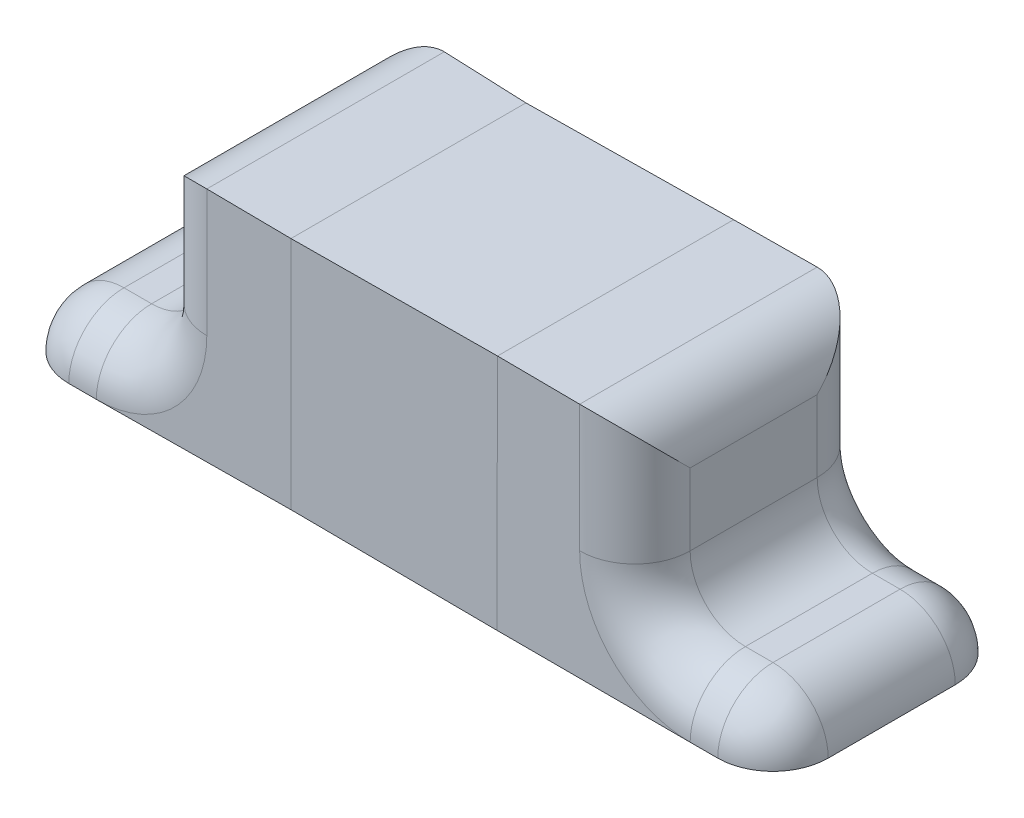
ISO-10303-21;
HEADER;
FILE_DESCRIPTION(('STEP AP214'),'2;1');
FILE_NAME('part.step','',(''),(''),'','','');
FILE_SCHEMA(('AUTOMOTIVE_DESIGN { 1 0 10303 214 1 1 1 1 }'));
ENDSEC;
DATA;
#1=APPLICATION_CONTEXT('core data for automotive mechanical design processes');
#2=APPLICATION_PROTOCOL_DEFINITION('international standard','automotive_design',2000,#1);
#3=PRODUCT_CONTEXT('',#1,'mechanical');
#4=PRODUCT('Part','Part','',(#3));
#5=PRODUCT_RELATED_PRODUCT_CATEGORY('part','',(#4));
#6=PRODUCT_DEFINITION_FORMATION('','',#4);
#7=PRODUCT_DEFINITION_CONTEXT('part definition',#1,'design');
#8=PRODUCT_DEFINITION('design','',#6,#7);
#9=PRODUCT_DEFINITION_SHAPE('','',#8);
#10=(LENGTH_UNIT() NAMED_UNIT(*) SI_UNIT(.MILLI.,.METRE.));
#11=(NAMED_UNIT(*) PLANE_ANGLE_UNIT() SI_UNIT($,.RADIAN.));
#12=(NAMED_UNIT(*) SI_UNIT($,.STERADIAN.) SOLID_ANGLE_UNIT());
#13=UNCERTAINTY_MEASURE_WITH_UNIT(LENGTH_MEASURE(1.E-05),#10,'distance_accuracy_value','');
#14=(GEOMETRIC_REPRESENTATION_CONTEXT(3) GLOBAL_UNCERTAINTY_ASSIGNED_CONTEXT((#13)) GLOBAL_UNIT_ASSIGNED_CONTEXT((#10,
#11,#12)) REPRESENTATION_CONTEXT('',''));
#15=CARTESIAN_POINT('',(0.,0.,0.));
#16=DIRECTION('',(0.,0.,1.));
#17=DIRECTION('',(1.,0.,0.));
#18=AXIS2_PLACEMENT_3D('',#15,#16,#17);
#19=CARTESIAN_POINT('',(-1.175,-0.00155700990971797,0.23));
#20=DIRECTION('',(0.,0.,1.));
#21=DIRECTION('',(1.,0.,0.));
#22=AXIS2_PLACEMENT_3D('',#19,#20,#21);
#23=SPHERICAL_SURFACE('',#22,0.2);
#24=CARTESIAN_POINT('',(-1.175,-0.00155700990971796,0.23));
#25=DIRECTION('',(0.,-1.,0.));
#26=DIRECTION('',(0.,0.,-1.));
#27=AXIS2_PLACEMENT_3D('',#24,#25,#26);
#28=CIRCLE('',#27,0.2);
#29=CARTESIAN_POINT('',(-1.175,-0.00155700990971797,0.43));
#30=VERTEX_POINT('',#29);
#31=CARTESIAN_POINT('',(-1.375,-0.00155700990971797,0.23));
#32=VERTEX_POINT('',#31);
#33=EDGE_CURVE('E393',#30,#32,#28,.T.);
#34=ORIENTED_EDGE('',*,*,#33,.F.);
#35=CARTESIAN_POINT('',(-1.175,-0.00155700990971797,0.23));
#36=DIRECTION('',(1.,0.,0.));
#37=DIRECTION('',(0.,0.,-1.));
#38=AXIS2_PLACEMENT_3D('',#35,#36,#37);
#39=CIRCLE('',#38,0.2);
#40=CARTESIAN_POINT('',(-1.175,0.198442990090282,0.23));
#41=VERTEX_POINT('',#40);
#42=EDGE_CURVE('E292',#41,#30,#39,.T.);
#43=ORIENTED_EDGE('',*,*,#42,.F.);
#44=CARTESIAN_POINT('',(-1.175,-0.00155700990971797,0.23));
#45=DIRECTION('',(0.,0.,-1.));
#46=DIRECTION('',(-1.,0.,0.));
#47=AXIS2_PLACEMENT_3D('',#44,#45,#46);
#48=CIRCLE('',#47,0.2);
#49=EDGE_CURVE('E332',#32,#41,#48,.T.);
#50=ORIENTED_EDGE('',*,*,#49,.F.);
#51=EDGE_LOOP('',(#34,#43,#50));
#52=FACE_BOUND('',#51,.T.);
#53=ADVANCED_FACE('F17',(#52),#23,.T.);
#54=CARTESIAN_POINT('',(-1.175,-0.00155700990971797,-0.23));
#55=DIRECTION('',(0.,0.,1.));
#56=DIRECTION('',(1.,0.,0.));
#57=AXIS2_PLACEMENT_3D('',#54,#55,#56);
#58=SPHERICAL_SURFACE('',#57,0.2);
#59=CARTESIAN_POINT('',(-1.175,-0.00155700990971793,-0.23));
#60=DIRECTION('',(0.,-1.,0.));
#61=DIRECTION('',(0.,0.,-1.));
#62=AXIS2_PLACEMENT_3D('',#59,#60,#61);
#63=CIRCLE('',#62,0.2);
#64=CARTESIAN_POINT('',(-1.375,-0.00155700990971797,-0.23));
#65=VERTEX_POINT('',#64);
#66=CARTESIAN_POINT('',(-1.175,-0.00155700990971792,-0.43));
#67=VERTEX_POINT('',#66);
#68=EDGE_CURVE('E284',#65,#67,#63,.T.);
#69=ORIENTED_EDGE('',*,*,#68,.F.);
#70=CARTESIAN_POINT('',(-1.175,-0.00155700990971797,-0.23));
#71=DIRECTION('',(0.,0.,1.));
#72=DIRECTION('',(-1.,0.,0.));
#73=AXIS2_PLACEMENT_3D('',#70,#71,#72);
#74=CIRCLE('',#73,0.2);
#75=CARTESIAN_POINT('',(-1.175,0.198442990090282,-0.23));
#76=VERTEX_POINT('',#75);
#77=EDGE_CURVE('E368',#76,#65,#74,.T.);
#78=ORIENTED_EDGE('',*,*,#77,.F.);
#79=CARTESIAN_POINT('',(-1.175,-0.00155700990971797,-0.23));
#80=DIRECTION('',(1.,0.,0.));
#81=DIRECTION('',(0.,0.,-1.));
#82=AXIS2_PLACEMENT_3D('',#79,#80,#81);
#83=CIRCLE('',#82,0.2);
#84=EDGE_CURVE('E45',#67,#76,#83,.T.);
#85=ORIENTED_EDGE('',*,*,#84,.F.);
#86=EDGE_LOOP('',(#69,#78,#85));
#87=FACE_BOUND('',#86,.T.);
#88=ADVANCED_FACE('F937',(#87),#58,.T.);
#89=CARTESIAN_POINT('',(-0.675,-0.00155700990971792,-0.23));
#90=DIRECTION('',(0.,-1.,0.));
#91=DIRECTION('',(0.,0.,-1.));
#92=AXIS2_PLACEMENT_3D('',#89,#90,#91);
#93=CYLINDRICAL_SURFACE('',#92,0.2);
#94=CARTESIAN_POINT('',(-0.675,0.398442990090282,-0.23));
#95=DIRECTION('',(0.,1.,0.));
#96=DIRECTION('',(0.,0.,-1.));
#97=AXIS2_PLACEMENT_3D('',#94,#95,#96);
#98=CIRCLE('',#97,0.2);
#99=CARTESIAN_POINT('',(-0.675,0.398442990090282,-0.43));
#100=VERTEX_POINT('',#99);
#101=CARTESIAN_POINT('',(-0.875,0.398442990090282,-0.23));
#102=VERTEX_POINT('',#101);
#103=EDGE_CURVE('E31',#100,#102,#98,.T.);
#104=ORIENTED_EDGE('',*,*,#103,.T.);
#105=DIRECTION('',(0.,-1.,0.));
#106=VECTOR('',#105,1.);
#107=CARTESIAN_POINT('',(-0.875,0.398442990090282,-0.23));
#108=LINE('',#107,#106);
#109=CARTESIAN_POINT('',(-0.875,0.658442990090282,-0.23));
#110=VERTEX_POINT('',#109);
#111=EDGE_CURVE('E337',#110,#102,#108,.T.);
#112=ORIENTED_EDGE('',*,*,#111,.F.);
#113=CARTESIAN_POINT('',(-0.675,0.658442990090282,-0.23));
#114=DIRECTION('',(0.,-0.707106781186548,-0.707106781186548));
#115=DIRECTION('',(0.,0.707106781186548,-0.707106781186548));
#116=AXIS2_PLACEMENT_3D('',#113,#114,#115);
#117=ELLIPSE('',#116,0.282842712474619,0.2);
#118=CARTESIAN_POINT('',(-0.675,0.858442990090282,-0.43));
#119=VERTEX_POINT('',#118);
#120=EDGE_CURVE('E11',#110,#119,#117,.T.);
#121=ORIENTED_EDGE('',*,*,#120,.T.);
#122=DIRECTION('',(0.,1.,0.));
#123=VECTOR('',#122,1.);
#124=CARTESIAN_POINT('',(-0.675,0.398442990090282,-0.43));
#125=LINE('',#124,#123);
#126=EDGE_CURVE('E274',#100,#119,#125,.T.);
#127=ORIENTED_EDGE('',*,*,#126,.F.);
#128=EDGE_LOOP('',(#104,#112,#121,#127));
#129=FACE_BOUND('',#128,.T.);
#130=ADVANCED_FACE('F943',(#129),#93,.T.);
#131=CARTESIAN_POINT('',(-0.675,0.658442990090282,0.43));
#132=DIRECTION('',(0.,0.,-1.));
#133=DIRECTION('',(-1.,0.,0.));
#134=AXIS2_PLACEMENT_3D('',#131,#132,#133);
#135=CYLINDRICAL_SURFACE('',#134,0.2);
#136=CARTESIAN_POINT('',(-0.675,0.658442990090282,0.23));
#137=DIRECTION('',(0.,0.707106781186548,-0.707106781186548));
#138=DIRECTION('',(0.,-0.707106781186548,-0.707106781186548));
#139=AXIS2_PLACEMENT_3D('',#136,#137,#138);
#140=ELLIPSE('',#139,0.282842712474619,0.2);
#141=CARTESIAN_POINT('',(-0.875,0.658442990090282,0.23));
#142=VERTEX_POINT('',#141);
#143=CARTESIAN_POINT('',(-0.675,0.858442990090282,0.43));
#144=VERTEX_POINT('',#143);
#145=EDGE_CURVE('E386',#142,#144,#140,.T.);
#146=ORIENTED_EDGE('',*,*,#145,.T.);
#147=DIRECTION('',(0.,0.,1.));
#148=VECTOR('',#147,1.);
#149=CARTESIAN_POINT('',(-0.675,0.858442990090282,-0.43));
#150=LINE('',#149,#148);
#151=EDGE_CURVE('E410',#119,#144,#150,.T.);
#152=ORIENTED_EDGE('',*,*,#151,.F.);
#153=ORIENTED_EDGE('',*,*,#120,.F.);
#154=DIRECTION('',(0.,0.,-1.));
#155=VECTOR('',#154,1.);
#156=CARTESIAN_POINT('',(-0.875,0.658442990090282,-0.23));
#157=LINE('',#156,#155);
#158=EDGE_CURVE('E333',#142,#110,#157,.T.);
#159=ORIENTED_EDGE('',*,*,#158,.F.);
#160=EDGE_LOOP('',(#146,#152,#153,#159));
#161=FACE_BOUND('',#160,.T.);
#162=ADVANCED_FACE('F535',(#161),#135,.T.);
#163=CARTESIAN_POINT('',(-1.075,0.398442990090282,-0.23));
#164=DIRECTION('',(0.,0.,-1.));
#165=DIRECTION('',(-1.,0.,0.));
#166=AXIS2_PLACEMENT_3D('',#163,#164,#165);
#167=TOROIDAL_SURFACE('',#166,0.4,0.2);
#168=CARTESIAN_POINT('',(-1.075,-0.00155700990971797,-0.23));
#169=DIRECTION('',(1.,0.,0.));
#170=DIRECTION('',(0.,0.,-1.));
#171=AXIS2_PLACEMENT_3D('',#168,#169,#170);
#172=CIRCLE('',#171,0.2);
#173=CARTESIAN_POINT('',(-1.075,-0.00155700990971792,-0.43));
#174=VERTEX_POINT('',#173);
#175=CARTESIAN_POINT('',(-1.075,0.198442990090282,-0.23));
#176=VERTEX_POINT('',#175);
#177=EDGE_CURVE('E92',#174,#176,#172,.T.);
#178=ORIENTED_EDGE('',*,*,#177,.T.);
#179=CARTESIAN_POINT('',(-1.075,0.398442990090282,-0.23));
#180=DIRECTION('',(0.,0.,1.));
#181=DIRECTION('',(-1.,0.,0.));
#182=AXIS2_PLACEMENT_3D('',#179,#180,#181);
#183=CIRCLE('',#182,0.2);
#184=EDGE_CURVE('E371',#176,#102,#183,.T.);
#185=ORIENTED_EDGE('',*,*,#184,.T.);
#186=ORIENTED_EDGE('',*,*,#103,.F.);
#187=CARTESIAN_POINT('',(-1.075,0.398442990090282,-0.43));
#188=DIRECTION('',(0.,0.,-1.));
#189=DIRECTION('',(-1.,0.,0.));
#190=AXIS2_PLACEMENT_3D('',#187,#188,#189);
#191=CIRCLE('',#190,0.4);
#192=EDGE_CURVE('E279',#100,#174,#191,.T.);
#193=ORIENTED_EDGE('',*,*,#192,.T.);
#194=EDGE_LOOP('',(#178,#185,#186,#193));
#195=FACE_BOUND('',#194,.T.);
#196=ADVANCED_FACE('F994',(#195),#167,.T.);
#197=CARTESIAN_POINT('',(-0.675,-0.00155700990971797,0.23));
#198=DIRECTION('',(0.,1.,0.));
#199=DIRECTION('',(0.,0.,1.));
#200=AXIS2_PLACEMENT_3D('',#197,#198,#199);
#201=CYLINDRICAL_SURFACE('',#200,0.2);
#202=CARTESIAN_POINT('',(-0.675,0.398442990090282,0.23));
#203=DIRECTION('',(0.,1.,0.));
#204=DIRECTION('',(0.,0.,-1.));
#205=AXIS2_PLACEMENT_3D('',#202,#203,#204);
#206=CIRCLE('',#205,0.2);
#207=CARTESIAN_POINT('',(-0.875,0.398442990090282,0.23));
#208=VERTEX_POINT('',#207);
#209=CARTESIAN_POINT('',(-0.675,0.398442990090282,0.43));
#210=VERTEX_POINT('',#209);
#211=EDGE_CURVE('E328',#208,#210,#206,.T.);
#212=ORIENTED_EDGE('',*,*,#211,.T.);
#213=DIRECTION('',(0.,-1.,0.));
#214=VECTOR('',#213,1.);
#215=CARTESIAN_POINT('',(-0.675,0.858442990090282,0.43));
#216=LINE('',#215,#214);
#217=EDGE_CURVE('E344',#144,#210,#216,.T.);
#218=ORIENTED_EDGE('',*,*,#217,.F.);
#219=ORIENTED_EDGE('',*,*,#145,.F.);
#220=DIRECTION('',(0.,1.,0.));
#221=VECTOR('',#220,1.);
#222=CARTESIAN_POINT('',(-0.875,0.658442990090282,0.23));
#223=LINE('',#222,#221);
#224=EDGE_CURVE('E338',#208,#142,#223,.T.);
#225=ORIENTED_EDGE('',*,*,#224,.F.);
#226=EDGE_LOOP('',(#212,#218,#219,#225));
#227=FACE_BOUND('',#226,.T.);
#228=ADVANCED_FACE('F630',(#227),#201,.T.);
#229=CARTESIAN_POINT('',(-0.875,-0.00155700990971797,-0.23));
#230=DIRECTION('',(1.,0.,0.));
#231=DIRECTION('',(0.,0.,-1.));
#232=AXIS2_PLACEMENT_3D('',#229,#230,#231);
#233=CYLINDRICAL_SURFACE('',#232,0.2);
#234=DIRECTION('',(1.,0.,0.));
#235=VECTOR('',#234,1.);
#236=CARTESIAN_POINT('',(-1.175,-0.00155700990971792,-0.43));
#237=LINE('',#236,#235);
#238=EDGE_CURVE('E280',#67,#174,#237,.T.);
#239=ORIENTED_EDGE('',*,*,#238,.F.);
#240=ORIENTED_EDGE('',*,*,#84,.T.);
#241=DIRECTION('',(-1.,0.,0.));
#242=VECTOR('',#241,1.);
#243=CARTESIAN_POINT('',(-1.175,0.198442990090282,-0.23));
#244=LINE('',#243,#242);
#245=EDGE_CURVE('E293',#176,#76,#244,.T.);
#246=ORIENTED_EDGE('',*,*,#245,.F.);
#247=ORIENTED_EDGE('',*,*,#177,.F.);
#248=EDGE_LOOP('',(#239,#240,#246,#247));
#249=FACE_BOUND('',#248,.T.);
#250=ADVANCED_FACE('F948',(#249),#233,.T.);
#251=CARTESIAN_POINT('',(-1.075,0.398442990090282,0.));
#252=DIRECTION('',(0.,0.,1.));
#253=DIRECTION('',(1.,0.,0.));
#254=AXIS2_PLACEMENT_3D('',#251,#252,#253);
#255=CYLINDRICAL_SURFACE('',#254,0.2);
#256=CARTESIAN_POINT('',(-1.075,0.398442990090282,0.23));
#257=DIRECTION('',(0.,0.,1.));
#258=DIRECTION('',(1.,0.,0.));
#259=AXIS2_PLACEMENT_3D('',#256,#257,#258);
#260=CIRCLE('',#259,0.2);
#261=CARTESIAN_POINT('',(-1.075,0.198442990090282,0.23));
#262=VERTEX_POINT('',#261);
#263=EDGE_CURVE('E331',#262,#208,#260,.T.);
#264=ORIENTED_EDGE('',*,*,#263,.T.);
#265=DIRECTION('',(0.,0.,1.));
#266=VECTOR('',#265,1.);
#267=CARTESIAN_POINT('',(-0.875,0.398442990090282,-0.23));
#268=LINE('',#267,#266);
#269=EDGE_CURVE('E305',#102,#208,#268,.T.);
#270=ORIENTED_EDGE('',*,*,#269,.F.);
#271=ORIENTED_EDGE('',*,*,#184,.F.);
#272=DIRECTION('',(0.,0.,-1.));
#273=VECTOR('',#272,1.);
#274=CARTESIAN_POINT('',(-1.075,0.198442990090282,-0.23));
#275=LINE('',#274,#273);
#276=EDGE_CURVE('E304',#262,#176,#275,.T.);
#277=ORIENTED_EDGE('',*,*,#276,.F.);
#278=EDGE_LOOP('',(#264,#270,#271,#277));
#279=FACE_BOUND('',#278,.T.);
#280=ADVANCED_FACE('F585',(#279),#255,.F.);
#281=CARTESIAN_POINT('',(-1.075,0.398442990090282,0.23));
#282=DIRECTION('',(0.,0.,1.));
#283=DIRECTION('',(1.,0.,0.));
#284=AXIS2_PLACEMENT_3D('',#281,#282,#283);
#285=TOROIDAL_SURFACE('',#284,0.4,0.2);
#286=ORIENTED_EDGE('',*,*,#211,.F.);
#287=ORIENTED_EDGE('',*,*,#263,.F.);
#288=CARTESIAN_POINT('',(-1.075,-0.00155700990971797,0.23));
#289=DIRECTION('',(1.,0.,0.));
#290=DIRECTION('',(0.,0.,-1.));
#291=AXIS2_PLACEMENT_3D('',#288,#289,#290);
#292=CIRCLE('',#291,0.2);
#293=CARTESIAN_POINT('',(-1.075,-0.00155700990971797,0.43));
#294=VERTEX_POINT('',#293);
#295=EDGE_CURVE('E406',#262,#294,#292,.T.);
#296=ORIENTED_EDGE('',*,*,#295,.T.);
#297=CARTESIAN_POINT('',(-1.075,0.398442990090282,0.43));
#298=DIRECTION('',(0.,0.,1.));
#299=DIRECTION('',(1.,0.,0.));
#300=AXIS2_PLACEMENT_3D('',#297,#298,#299);
#301=CIRCLE('',#300,0.4);
#302=EDGE_CURVE('E348',#294,#210,#301,.T.);
#303=ORIENTED_EDGE('',*,*,#302,.T.);
#304=EDGE_LOOP('',(#286,#287,#296,#303));
#305=FACE_BOUND('',#304,.T.);
#306=ADVANCED_FACE('F961',(#305),#285,.T.);
#307=CARTESIAN_POINT('',(-1.175,-0.00155700990971797,0.43));
#308=DIRECTION('',(0.,0.,-1.));
#309=DIRECTION('',(-1.,0.,0.));
#310=AXIS2_PLACEMENT_3D('',#307,#308,#309);
#311=CYLINDRICAL_SURFACE('',#310,0.2);
#312=DIRECTION('',(0.,0.,1.));
#313=VECTOR('',#312,1.);
#314=CARTESIAN_POINT('',(-1.175,0.198442990090282,-0.23));
#315=LINE('',#314,#313);
#316=EDGE_CURVE('E289',#76,#41,#315,.T.);
#317=ORIENTED_EDGE('',*,*,#316,.F.);
#318=ORIENTED_EDGE('',*,*,#77,.T.);
#319=DIRECTION('',(0.,0.,-1.));
#320=VECTOR('',#319,1.);
#321=CARTESIAN_POINT('',(-1.375,-0.00155700990971797,0.23));
#322=LINE('',#321,#320);
#323=EDGE_CURVE('E317',#32,#65,#322,.T.);
#324=ORIENTED_EDGE('',*,*,#323,.F.);
#325=ORIENTED_EDGE('',*,*,#49,.T.);
#326=EDGE_LOOP('',(#317,#318,#324,#325));
#327=FACE_BOUND('',#326,.T.);
#328=ADVANCED_FACE('F628',(#327),#311,.T.);
#329=CARTESIAN_POINT('',(-1.375,-0.00155700990971797,0.23));
#330=DIRECTION('',(1.,0.,0.));
#331=DIRECTION('',(0.,0.,-1.));
#332=AXIS2_PLACEMENT_3D('',#329,#330,#331);
#333=CYLINDRICAL_SURFACE('',#332,0.2);
#334=DIRECTION('',(1.,0.,0.));
#335=VECTOR('',#334,1.);
#336=CARTESIAN_POINT('',(-1.175,0.198442990090282,0.23));
#337=LINE('',#336,#335);
#338=EDGE_CURVE('E300',#41,#262,#337,.T.);
#339=ORIENTED_EDGE('',*,*,#338,.F.);
#340=ORIENTED_EDGE('',*,*,#42,.T.);
#341=DIRECTION('',(1.,0.,0.));
#342=VECTOR('',#341,1.);
#343=CARTESIAN_POINT('',(-1.175,-0.00155700990971797,0.43));
#344=LINE('',#343,#342);
#345=EDGE_CURVE('E389',#30,#294,#344,.T.);
#346=ORIENTED_EDGE('',*,*,#345,.T.);
#347=ORIENTED_EDGE('',*,*,#295,.F.);
#348=EDGE_LOOP('',(#339,#340,#346,#347));
#349=FACE_BOUND('',#348,.T.);
#350=ADVANCED_FACE('F951',(#349),#333,.T.);
#351=CARTESIAN_POINT('',(-1.375,0.198442990090282,0.43));
#352=DIRECTION('',(0.,1.,0.));
#353=DIRECTION('',(1.,0.,0.));
#354=AXIS2_PLACEMENT_3D('',#351,#352,#353);
#355=PLANE('',#354);
#356=ORIENTED_EDGE('',*,*,#338,.T.);
#357=ORIENTED_EDGE('',*,*,#276,.T.);
#358=ORIENTED_EDGE('',*,*,#245,.T.);
#359=ORIENTED_EDGE('',*,*,#316,.T.);
#360=EDGE_LOOP('',(#356,#357,#358,#359));
#361=FACE_BOUND('',#360,.T.);
#362=ADVANCED_FACE('F953',(#361),#355,.T.);
#363=CARTESIAN_POINT('',(-0.875,0.,0.));
#364=DIRECTION('',(1.,0.,0.));
#365=DIRECTION('',(0.,1.,0.));
#366=AXIS2_PLACEMENT_3D('',#363,#364,#365);
#367=PLANE('',#366);
#368=ORIENTED_EDGE('',*,*,#224,.T.);
#369=ORIENTED_EDGE('',*,*,#158,.T.);
#370=ORIENTED_EDGE('',*,*,#111,.T.);
#371=ORIENTED_EDGE('',*,*,#269,.T.);
#372=EDGE_LOOP('',(#368,#369,#370,#371));
#373=FACE_BOUND('',#372,.T.);
#374=ADVANCED_FACE('F584',(#373),#367,.F.);
#375=CARTESIAN_POINT('',(-0.875,0.858442990090282,0.43));
#376=DIRECTION('',(0.,1.,0.));
#377=DIRECTION('',(1.,0.,0.));
#378=AXIS2_PLACEMENT_3D('',#375,#376,#377);
#379=PLANE('',#378);
#380=DIRECTION('',(1.,0.,0.));
#381=VECTOR('',#380,1.);
#382=CARTESIAN_POINT('',(-0.675,0.858442990090282,-0.43));
#383=LINE('',#382,#381);
#384=CARTESIAN_POINT('',(-0.375,0.850589164882133,-0.425348907718612));
#385=VERTEX_POINT('',#384);
#386=EDGE_CURVE('E278',#119,#385,#383,.T.);
#387=ORIENTED_EDGE('',*,*,#386,.F.);
#388=ORIENTED_EDGE('',*,*,#151,.T.);
#389=DIRECTION('',(1.,0.,0.));
#390=VECTOR('',#389,1.);
#391=CARTESIAN_POINT('',(-0.675,0.858442990090282,0.43));
#392=LINE('',#391,#390);
#393=CARTESIAN_POINT('',(-0.375,0.850589164882133,0.425348907718612));
#394=VERTEX_POINT('',#393);
#395=EDGE_CURVE('E349',#144,#394,#392,.T.);
#396=ORIENTED_EDGE('',*,*,#395,.T.);
#397=CARTESIAN_POINT('',(-0.375,0.85,-0.425348907718612));
#398=DIRECTION('',(0.,0.,1.));
#399=VECTOR('',#398,1.);
#400=LINE('',#397,#399);
#401=EDGE_CURVE('E460',#385,#394,#400,.T.);
#402=ORIENTED_EDGE('',*,*,#401,.F.);
#403=EDGE_LOOP('',(#387,#388,#396,#402));
#404=FACE_BOUND('',#403,.T.);
#405=ADVANCED_FACE('F574',(#404),#379,.T.);
#406=CARTESIAN_POINT('',(-0.875,-0.00155700990971797,0.43));
#407=DIRECTION('',(0.,0.,1.));
#408=DIRECTION('',(1.,0.,0.));
#409=AXIS2_PLACEMENT_3D('',#406,#407,#408);
#410=PLANE('',#409);
#411=ORIENTED_EDGE('',*,*,#395,.F.);
#412=ORIENTED_EDGE('',*,*,#217,.T.);
#413=ORIENTED_EDGE('',*,*,#302,.F.);
#414=DIRECTION('',(1.,0.,0.));
#415=VECTOR('',#414,1.);
#416=CARTESIAN_POINT('',(-1.075,-0.00155700990971797,0.43));
#417=LINE('',#416,#415);
#418=CARTESIAN_POINT('',(-0.375,-3.52055770356281E-05,0.42511305508339));
#419=VERTEX_POINT('',#418);
#420=EDGE_CURVE('E283',#294,#419,#417,.T.);
#421=ORIENTED_EDGE('',*,*,#420,.T.);
#422=CARTESIAN_POINT('',(-0.375,0.850589164882133,0.425));
#423=DIRECTION('',(0.,-1.,0.));
#424=VECTOR('',#423,1.);
#425=LINE('',#422,#424);
#426=EDGE_CURVE('E472',#394,#419,#425,.T.);
#427=ORIENTED_EDGE('',*,*,#426,.F.);
#428=EDGE_LOOP('',(#411,#412,#413,#421,#427));
#429=FACE_BOUND('',#428,.T.);
#430=ADVANCED_FACE('F583',(#429),#410,.T.);
#431=CARTESIAN_POINT('',(-0.875,-0.00155700990971797,0.43));
#432=DIRECTION('',(0.,-1.,0.));
#433=DIRECTION('',(0.,0.,-1.));
#434=AXIS2_PLACEMENT_3D('',#431,#432,#433);
#435=PLANE('',#434);
#436=ORIENTED_EDGE('',*,*,#323,.T.);
#437=ORIENTED_EDGE('',*,*,#68,.T.);
#438=ORIENTED_EDGE('',*,*,#238,.T.);
#439=DIRECTION('',(1.,0.,0.));
#440=VECTOR('',#439,1.);
#441=CARTESIAN_POINT('',(-1.075,-0.00155700990971792,-0.43));
#442=LINE('',#441,#440);
#443=CARTESIAN_POINT('',(-0.375,-3.52055770356799E-05,-0.42511305508339));
#444=VERTEX_POINT('',#443);
#445=EDGE_CURVE('E362',#174,#444,#442,.T.);
#446=ORIENTED_EDGE('',*,*,#445,.T.);
#447=CARTESIAN_POINT('',(-0.375,0.,0.42511305508339));
#448=DIRECTION('',(0.,0.,-1.));
#449=VECTOR('',#448,1.);
#450=LINE('',#447,#449);
#451=EDGE_CURVE('E726',#419,#444,#450,.T.);
#452=ORIENTED_EDGE('',*,*,#451,.F.);
#453=ORIENTED_EDGE('',*,*,#420,.F.);
#454=ORIENTED_EDGE('',*,*,#345,.F.);
#455=ORIENTED_EDGE('',*,*,#33,.T.);
#456=EDGE_LOOP('',(#436,#437,#438,#446,#452,#453,#454,#455));
#457=FACE_BOUND('',#456,.T.);
#458=ADVANCED_FACE('F973',(#457),#435,.T.);
#459=CARTESIAN_POINT('',(-0.875,-0.00155700990971792,-0.43));
#460=DIRECTION('',(0.,0.,-1.));
#461=DIRECTION('',(0.,-1.,0.));
#462=AXIS2_PLACEMENT_3D('',#459,#460,#461);
#463=PLANE('',#462);
#464=ORIENTED_EDGE('',*,*,#192,.F.);
#465=ORIENTED_EDGE('',*,*,#126,.T.);
#466=ORIENTED_EDGE('',*,*,#386,.T.);
#467=CARTESIAN_POINT('',(-0.375,-3.52055770356799E-05,-0.425));
#468=DIRECTION('',(0.,1.,0.));
#469=VECTOR('',#468,1.);
#470=LINE('',#467,#469);
#471=EDGE_CURVE('E437',#444,#385,#470,.T.);
#472=ORIENTED_EDGE('',*,*,#471,.F.);
#473=ORIENTED_EDGE('',*,*,#445,.F.);
#474=EDGE_LOOP('',(#464,#465,#466,#472,#473));
#475=FACE_BOUND('',#474,.T.);
#476=ADVANCED_FACE('F644',(#475),#463,.T.);
#477=CARTESIAN_POINT('',(1.175,-0.00155700990971797,0.23));
#478=DIRECTION('',(0.,0.,1.));
#479=DIRECTION('',(1.,0.,0.));
#480=AXIS2_PLACEMENT_3D('',#477,#478,#479);
#481=SPHERICAL_SURFACE('',#480,0.2);
#482=CARTESIAN_POINT('',(1.175,-0.00155700990971797,0.23));
#483=DIRECTION('',(0.,0.,-1.));
#484=DIRECTION('',(1.,0.,0.));
#485=AXIS2_PLACEMENT_3D('',#482,#483,#484);
#486=CIRCLE('',#485,0.2);
#487=CARTESIAN_POINT('',(1.175,0.198442990090282,0.23));
#488=VERTEX_POINT('',#487);
#489=CARTESIAN_POINT('',(1.375,-0.00155700990971797,0.23));
#490=VERTEX_POINT('',#489);
#491=EDGE_CURVE('E242',#488,#490,#486,.T.);
#492=ORIENTED_EDGE('',*,*,#491,.F.);
#493=CARTESIAN_POINT('',(1.175,-0.00155700990971797,0.23));
#494=DIRECTION('',(-1.,0.,0.));
#495=DIRECTION('',(0.,0.,1.));
#496=AXIS2_PLACEMENT_3D('',#493,#494,#495);
#497=CIRCLE('',#496,0.2);
#498=CARTESIAN_POINT('',(1.175,-0.00155700990971797,0.43));
#499=VERTEX_POINT('',#498);
#500=EDGE_CURVE('E253',#499,#488,#497,.T.);
#501=ORIENTED_EDGE('',*,*,#500,.F.);
#502=CARTESIAN_POINT('',(1.175,-0.00155700990971796,0.23));
#503=DIRECTION('',(0.,-1.,0.));
#504=DIRECTION('',(0.,0.,1.));
#505=AXIS2_PLACEMENT_3D('',#502,#503,#504);
#506=CIRCLE('',#505,0.2);
#507=EDGE_CURVE('E269',#490,#499,#506,.T.);
#508=ORIENTED_EDGE('',*,*,#507,.F.);
#509=EDGE_LOOP('',(#492,#501,#508));
#510=FACE_BOUND('',#509,.T.);
#511=ADVANCED_FACE('F1119',(#510),#481,.T.);
#512=CARTESIAN_POINT('',(1.175,-0.00155700990971797,-0.23));
#513=DIRECTION('',(0.,0.,1.));
#514=DIRECTION('',(1.,0.,0.));
#515=AXIS2_PLACEMENT_3D('',#512,#513,#514);
#516=SPHERICAL_SURFACE('',#515,0.2);
#517=CARTESIAN_POINT('',(1.175,-0.00155700990971797,-0.23));
#518=DIRECTION('',(-1.,0.,0.));
#519=DIRECTION('',(0.,0.,1.));
#520=AXIS2_PLACEMENT_3D('',#517,#518,#519);
#521=CIRCLE('',#520,0.2);
#522=CARTESIAN_POINT('',(1.175,0.198442990090282,-0.23));
#523=VERTEX_POINT('',#522);
#524=CARTESIAN_POINT('',(1.175,-0.00155700990971792,-0.43));
#525=VERTEX_POINT('',#524);
#526=EDGE_CURVE('E218',#523,#525,#521,.T.);
#527=ORIENTED_EDGE('',*,*,#526,.F.);
#528=CARTESIAN_POINT('',(1.175,-0.00155700990971797,-0.23));
#529=DIRECTION('',(0.,0.,1.));
#530=DIRECTION('',(1.,0.,0.));
#531=AXIS2_PLACEMENT_3D('',#528,#529,#530);
#532=CIRCLE('',#531,0.2);
#533=CARTESIAN_POINT('',(1.375,-0.00155700990971797,-0.23));
#534=VERTEX_POINT('',#533);
#535=EDGE_CURVE('E221',#534,#523,#532,.T.);
#536=ORIENTED_EDGE('',*,*,#535,.F.);
#537=CARTESIAN_POINT('',(1.175,-0.00155700990971793,-0.23));
#538=DIRECTION('',(0.,-1.,0.));
#539=DIRECTION('',(0.,0.,1.));
#540=AXIS2_PLACEMENT_3D('',#537,#538,#539);
#541=CIRCLE('',#540,0.2);
#542=EDGE_CURVE('E224',#525,#534,#541,.T.);
#543=ORIENTED_EDGE('',*,*,#542,.F.);
#544=EDGE_LOOP('',(#527,#536,#543));
#545=FACE_BOUND('',#544,.T.);
#546=ADVANCED_FACE('F220',(#545),#516,.T.);
#547=CARTESIAN_POINT('',(0.675,0.,-0.23));
#548=DIRECTION('',(0.,1.,0.));
#549=DIRECTION('',(0.,0.,1.));
#550=AXIS2_PLACEMENT_3D('',#547,#548,#549);
#551=CYLINDRICAL_SURFACE('',#550,0.2);
#552=CARTESIAN_POINT('',(0.675,0.398442990090282,-0.23));
#553=DIRECTION('',(0.,1.,0.));
#554=DIRECTION('',(0.,0.,-1.));
#555=AXIS2_PLACEMENT_3D('',#552,#553,#554);
#556=CIRCLE('',#555,0.2);
#557=CARTESIAN_POINT('',(0.875,0.398442990090282,-0.23));
#558=VERTEX_POINT('',#557);
#559=CARTESIAN_POINT('',(0.675,0.398442990090282,-0.43));
#560=VERTEX_POINT('',#559);
#561=EDGE_CURVE('E288',#558,#560,#556,.T.);
#562=ORIENTED_EDGE('',*,*,#561,.T.);
#563=DIRECTION('',(0.,-1.,0.));
#564=VECTOR('',#563,1.);
#565=CARTESIAN_POINT('',(0.675,0.398442990090282,-0.43));
#566=LINE('',#565,#564);
#567=CARTESIAN_POINT('',(0.675,0.858442990090282,-0.43));
#568=VERTEX_POINT('',#567);
#569=EDGE_CURVE('E355',#568,#560,#566,.T.);
#570=ORIENTED_EDGE('',*,*,#569,.F.);
#571=CARTESIAN_POINT('',(0.675,0.658442990090282,-0.23));
#572=DIRECTION('',(0.,-0.707106781186548,-0.707106781186548));
#573=DIRECTION('',(0.,-0.707106781186548,0.707106781186548));
#574=AXIS2_PLACEMENT_3D('',#571,#572,#573);
#575=ELLIPSE('',#574,0.282842712474619,0.2);
#576=CARTESIAN_POINT('',(0.875,0.658442990090282,-0.23));
#577=VERTEX_POINT('',#576);
#578=EDGE_CURVE('E285',#568,#577,#575,.T.);
#579=ORIENTED_EDGE('',*,*,#578,.T.);
#580=DIRECTION('',(0.,1.,0.));
#581=VECTOR('',#580,1.);
#582=CARTESIAN_POINT('',(0.875,0.398442990090282,-0.23));
#583=LINE('',#582,#581);
#584=EDGE_CURVE('E306',#558,#577,#583,.T.);
#585=ORIENTED_EDGE('',*,*,#584,.F.);
#586=EDGE_LOOP('',(#562,#570,#579,#585));
#587=FACE_BOUND('',#586,.T.);
#588=ADVANCED_FACE('F1137',(#587),#551,.T.);
#589=CARTESIAN_POINT('',(0.675,0.658442990090282,0.));
#590=DIRECTION('',(0.,0.,1.));
#591=DIRECTION('',(1.,0.,0.));
#592=AXIS2_PLACEMENT_3D('',#589,#590,#591);
#593=CYLINDRICAL_SURFACE('',#592,0.2);
#594=CARTESIAN_POINT('',(0.675,0.658442990090282,0.23));
#595=DIRECTION('',(0.,0.707106781186548,-0.707106781186548));
#596=DIRECTION('',(0.,0.707106781186548,0.707106781186548));
#597=AXIS2_PLACEMENT_3D('',#594,#595,#596);
#598=ELLIPSE('',#597,0.282842712474619,0.2);
#599=CARTESIAN_POINT('',(0.675,0.858442990090282,0.43));
#600=VERTEX_POINT('',#599);
#601=CARTESIAN_POINT('',(0.875,0.658442990090282,0.23));
#602=VERTEX_POINT('',#601);
#603=EDGE_CURVE('E295',#600,#602,#598,.T.);
#604=ORIENTED_EDGE('',*,*,#603,.T.);
#605=DIRECTION('',(0.,0.,1.));
#606=VECTOR('',#605,1.);
#607=CARTESIAN_POINT('',(0.875,0.658442990090282,-0.23));
#608=LINE('',#607,#606);
#609=EDGE_CURVE('E310',#577,#602,#608,.T.);
#610=ORIENTED_EDGE('',*,*,#609,.F.);
#611=ORIENTED_EDGE('',*,*,#578,.F.);
#612=DIRECTION('',(0.,0.,-1.));
#613=VECTOR('',#612,1.);
#614=CARTESIAN_POINT('',(0.675,0.858442990090282,-0.43));
#615=LINE('',#614,#613);
#616=EDGE_CURVE('E318',#600,#568,#615,.T.);
#617=ORIENTED_EDGE('',*,*,#616,.F.);
#618=EDGE_LOOP('',(#604,#610,#611,#617));
#619=FACE_BOUND('',#618,.T.);
#620=ADVANCED_FACE('F546',(#619),#593,.T.);
#621=CARTESIAN_POINT('',(1.075,0.398442990090282,-0.23));
#622=DIRECTION('',(0.,0.,1.));
#623=DIRECTION('',(1.,0.,0.));
#624=AXIS2_PLACEMENT_3D('',#621,#622,#623);
#625=TOROIDAL_SURFACE('',#624,0.4,0.2);
#626=CARTESIAN_POINT('',(1.075,-0.00155700990971797,-0.23));
#627=DIRECTION('',(-1.,0.,0.));
#628=DIRECTION('',(0.,0.,1.));
#629=AXIS2_PLACEMENT_3D('',#626,#627,#628);
#630=CIRCLE('',#629,0.2);
#631=CARTESIAN_POINT('',(1.075,0.198442990090282,-0.23));
#632=VERTEX_POINT('',#631);
#633=CARTESIAN_POINT('',(1.075,-0.00155700990971792,-0.43));
#634=VERTEX_POINT('',#633);
#635=EDGE_CURVE('E230',#632,#634,#630,.T.);
#636=ORIENTED_EDGE('',*,*,#635,.T.);
#637=CARTESIAN_POINT('',(1.075,0.398442990090282,-0.43));
#638=DIRECTION('',(0.,0.,-1.));
#639=DIRECTION('',(1.,0.,0.));
#640=AXIS2_PLACEMENT_3D('',#637,#638,#639);
#641=CIRCLE('',#640,0.4);
#642=EDGE_CURVE('E350',#634,#560,#641,.T.);
#643=ORIENTED_EDGE('',*,*,#642,.T.);
#644=ORIENTED_EDGE('',*,*,#561,.F.);
#645=CARTESIAN_POINT('',(1.075,0.398442990090282,-0.23));
#646=DIRECTION('',(0.,0.,1.));
#647=DIRECTION('',(1.,0.,0.));
#648=AXIS2_PLACEMENT_3D('',#645,#646,#647);
#649=CIRCLE('',#648,0.2);
#650=EDGE_CURVE('E299',#558,#632,#649,.T.);
#651=ORIENTED_EDGE('',*,*,#650,.T.);
#652=EDGE_LOOP('',(#636,#643,#644,#651));
#653=FACE_BOUND('',#652,.T.);
#654=ADVANCED_FACE('F590',(#653),#625,.T.);
#655=CARTESIAN_POINT('',(0.675,0.,0.23));
#656=DIRECTION('',(0.,-1.,0.));
#657=DIRECTION('',(0.,0.,-1.));
#658=AXIS2_PLACEMENT_3D('',#655,#656,#657);
#659=CYLINDRICAL_SURFACE('',#658,0.2);
#660=CARTESIAN_POINT('',(0.675,0.398442990090282,0.23));
#661=DIRECTION('',(0.,1.,0.));
#662=DIRECTION('',(0.,0.,-1.));
#663=AXIS2_PLACEMENT_3D('',#660,#661,#662);
#664=CIRCLE('',#663,0.2);
#665=CARTESIAN_POINT('',(0.675,0.398442990090282,0.43));
#666=VERTEX_POINT('',#665);
#667=CARTESIAN_POINT('',(0.875,0.398442990090282,0.23));
#668=VERTEX_POINT('',#667);
#669=EDGE_CURVE('E231',#666,#668,#664,.T.);
#670=ORIENTED_EDGE('',*,*,#669,.T.);
#671=DIRECTION('',(0.,-1.,0.));
#672=VECTOR('',#671,1.);
#673=CARTESIAN_POINT('',(0.875,0.658442990090282,0.23));
#674=LINE('',#673,#672);
#675=EDGE_CURVE('E327',#602,#668,#674,.T.);
#676=ORIENTED_EDGE('',*,*,#675,.F.);
#677=ORIENTED_EDGE('',*,*,#603,.F.);
#678=DIRECTION('',(0.,1.,0.));
#679=VECTOR('',#678,1.);
#680=CARTESIAN_POINT('',(0.675,0.858442990090282,0.43));
#681=LINE('',#680,#679);
#682=EDGE_CURVE('E339',#666,#600,#681,.T.);
#683=ORIENTED_EDGE('',*,*,#682,.F.);
#684=EDGE_LOOP('',(#670,#676,#677,#683));
#685=FACE_BOUND('',#684,.T.);
#686=ADVANCED_FACE('F586',(#685),#659,.T.);
#687=CARTESIAN_POINT('',(1.075,0.398442990090282,0.43));
#688=DIRECTION('',(0.,0.,-1.));
#689=DIRECTION('',(-1.,0.,0.));
#690=AXIS2_PLACEMENT_3D('',#687,#688,#689);
#691=CYLINDRICAL_SURFACE('',#690,0.2);
#692=CARTESIAN_POINT('',(1.075,0.398442990090282,0.23));
#693=DIRECTION('',(0.,0.,1.));
#694=DIRECTION('',(-1.,0.,0.));
#695=AXIS2_PLACEMENT_3D('',#692,#693,#694);
#696=CIRCLE('',#695,0.2);
#697=CARTESIAN_POINT('',(1.075,0.198442990090282,0.23));
#698=VERTEX_POINT('',#697);
#699=EDGE_CURVE('E381',#668,#698,#696,.T.);
#700=ORIENTED_EDGE('',*,*,#699,.T.);
#701=DIRECTION('',(0.,0.,1.));
#702=VECTOR('',#701,1.);
#703=CARTESIAN_POINT('',(1.075,0.198442990090282,-0.23));
#704=LINE('',#703,#702);
#705=EDGE_CURVE('E259',#632,#698,#704,.T.);
#706=ORIENTED_EDGE('',*,*,#705,.F.);
#707=ORIENTED_EDGE('',*,*,#650,.F.);
#708=DIRECTION('',(0.,0.,-1.));
#709=VECTOR('',#708,1.);
#710=CARTESIAN_POINT('',(0.875,0.398442990090282,-0.23));
#711=LINE('',#710,#709);
#712=EDGE_CURVE('E433',#668,#558,#711,.T.);
#713=ORIENTED_EDGE('',*,*,#712,.F.);
#714=EDGE_LOOP('',(#700,#706,#707,#713));
#715=FACE_BOUND('',#714,.T.);
#716=ADVANCED_FACE('F589',(#715),#691,.F.);
#717=CARTESIAN_POINT('',(1.375,-0.00155700990971797,-0.23));
#718=DIRECTION('',(-1.,0.,0.));
#719=DIRECTION('',(0.,0.,1.));
#720=AXIS2_PLACEMENT_3D('',#717,#718,#719);
#721=CYLINDRICAL_SURFACE('',#720,0.2);
#722=DIRECTION('',(-1.,0.,0.));
#723=VECTOR('',#722,1.);
#724=CARTESIAN_POINT('',(1.175,0.198442990090282,-0.23));
#725=LINE('',#724,#723);
#726=EDGE_CURVE('E249',#523,#632,#725,.T.);
#727=ORIENTED_EDGE('',*,*,#726,.F.);
#728=ORIENTED_EDGE('',*,*,#526,.T.);
#729=DIRECTION('',(-1.,0.,0.));
#730=VECTOR('',#729,1.);
#731=CARTESIAN_POINT('',(1.175,-0.00155700990971792,-0.43));
#732=LINE('',#731,#730);
#733=EDGE_CURVE('E358',#525,#634,#732,.T.);
#734=ORIENTED_EDGE('',*,*,#733,.T.);
#735=ORIENTED_EDGE('',*,*,#635,.F.);
#736=EDGE_LOOP('',(#727,#728,#734,#735));
#737=FACE_BOUND('',#736,.T.);
#738=ADVANCED_FACE('F256',(#737),#721,.T.);
#739=CARTESIAN_POINT('',(1.075,0.398442990090282,0.23));
#740=DIRECTION('',(0.,0.,-1.));
#741=DIRECTION('',(-1.,0.,0.));
#742=AXIS2_PLACEMENT_3D('',#739,#740,#741);
#743=TOROIDAL_SURFACE('',#742,0.4,0.2);
#744=CARTESIAN_POINT('',(1.075,0.398442990090282,0.43));
#745=DIRECTION('',(0.,0.,1.));
#746=DIRECTION('',(-1.,0.,0.));
#747=AXIS2_PLACEMENT_3D('',#744,#745,#746);
#748=CIRCLE('',#747,0.4);
#749=CARTESIAN_POINT('',(1.075,-0.00155700990971797,0.43));
#750=VERTEX_POINT('',#749);
#751=EDGE_CURVE('E322',#666,#750,#748,.T.);
#752=ORIENTED_EDGE('',*,*,#751,.T.);
#753=CARTESIAN_POINT('',(1.075,-0.00155700990971797,0.23));
#754=DIRECTION('',(-1.,0.,0.));
#755=DIRECTION('',(0.,0.,1.));
#756=AXIS2_PLACEMENT_3D('',#753,#754,#755);
#757=CIRCLE('',#756,0.2);
#758=EDGE_CURVE('E243',#750,#698,#757,.T.);
#759=ORIENTED_EDGE('',*,*,#758,.T.);
#760=ORIENTED_EDGE('',*,*,#699,.F.);
#761=ORIENTED_EDGE('',*,*,#669,.F.);
#762=EDGE_LOOP('',(#752,#759,#760,#761));
#763=FACE_BOUND('',#762,.T.);
#764=ADVANCED_FACE('F920',(#763),#743,.T.);
#765=CARTESIAN_POINT('',(1.175,-0.00155700990971797,0.));
#766=DIRECTION('',(0.,0.,1.));
#767=DIRECTION('',(1.,0.,0.));
#768=AXIS2_PLACEMENT_3D('',#765,#766,#767);
#769=CYLINDRICAL_SURFACE('',#768,0.2);
#770=DIRECTION('',(0.,0.,-1.));
#771=VECTOR('',#770,1.);
#772=CARTESIAN_POINT('',(1.375,-0.00155700990971797,0.23));
#773=LINE('',#772,#771);
#774=EDGE_CURVE('E240',#490,#534,#773,.T.);
#775=ORIENTED_EDGE('',*,*,#774,.T.);
#776=ORIENTED_EDGE('',*,*,#535,.T.);
#777=DIRECTION('',(0.,0.,-1.));
#778=VECTOR('',#777,1.);
#779=CARTESIAN_POINT('',(1.175,0.198442990090282,-0.23));
#780=LINE('',#779,#778);
#781=EDGE_CURVE('E237',#488,#523,#780,.T.);
#782=ORIENTED_EDGE('',*,*,#781,.F.);
#783=ORIENTED_EDGE('',*,*,#491,.T.);
#784=EDGE_LOOP('',(#775,#776,#782,#783));
#785=FACE_BOUND('',#784,.T.);
#786=ADVANCED_FACE('F236',(#785),#769,.T.);
#787=CARTESIAN_POINT('',(0.875,-0.00155700990971797,0.23));
#788=DIRECTION('',(-1.,0.,0.));
#789=DIRECTION('',(0.,0.,1.));
#790=AXIS2_PLACEMENT_3D('',#787,#788,#789);
#791=CYLINDRICAL_SURFACE('',#790,0.2);
#792=DIRECTION('',(-1.,0.,0.));
#793=VECTOR('',#792,1.);
#794=CARTESIAN_POINT('',(1.175,-0.00155700990971797,0.43));
#795=LINE('',#794,#793);
#796=EDGE_CURVE('E260',#499,#750,#795,.T.);
#797=ORIENTED_EDGE('',*,*,#796,.F.);
#798=ORIENTED_EDGE('',*,*,#500,.T.);
#799=DIRECTION('',(1.,0.,0.));
#800=VECTOR('',#799,1.);
#801=CARTESIAN_POINT('',(1.175,0.198442990090282,0.23));
#802=LINE('',#801,#800);
#803=EDGE_CURVE('E251',#698,#488,#802,.T.);
#804=ORIENTED_EDGE('',*,*,#803,.F.);
#805=ORIENTED_EDGE('',*,*,#758,.F.);
#806=EDGE_LOOP('',(#797,#798,#804,#805));
#807=FACE_BOUND('',#806,.T.);
#808=ADVANCED_FACE('F539',(#807),#791,.T.);
#809=CARTESIAN_POINT('',(1.375,0.198442990090282,0.43));
#810=DIRECTION('',(0.,-1.,0.));
#811=DIRECTION('',(0.,0.,-1.));
#812=AXIS2_PLACEMENT_3D('',#809,#810,#811);
#813=PLANE('',#812);
#814=ORIENTED_EDGE('',*,*,#726,.T.);
#815=ORIENTED_EDGE('',*,*,#705,.T.);
#816=ORIENTED_EDGE('',*,*,#803,.T.);
#817=ORIENTED_EDGE('',*,*,#781,.T.);
#818=EDGE_LOOP('',(#814,#815,#816,#817));
#819=FACE_BOUND('',#818,.T.);
#820=ADVANCED_FACE('F247',(#819),#813,.F.);
#821=CARTESIAN_POINT('',(0.875,-0.00155700990971797,0.43));
#822=DIRECTION('',(0.,1.,0.));
#823=DIRECTION('',(0.,0.,-1.));
#824=AXIS2_PLACEMENT_3D('',#821,#822,#823);
#825=PLANE('',#824);
#826=ORIENTED_EDGE('',*,*,#733,.F.);
#827=ORIENTED_EDGE('',*,*,#542,.T.);
#828=ORIENTED_EDGE('',*,*,#774,.F.);
#829=ORIENTED_EDGE('',*,*,#507,.T.);
#830=ORIENTED_EDGE('',*,*,#796,.T.);
#831=DIRECTION('',(-1.,0.,0.));
#832=VECTOR('',#831,1.);
#833=CARTESIAN_POINT('',(1.075,-0.00155700990971797,0.43));
#834=LINE('',#833,#832);
#835=CARTESIAN_POINT('',(0.375,-0.00048656559678623,0.429992424125441));
#836=VERTEX_POINT('',#835);
#837=EDGE_CURVE('E343',#750,#836,#834,.T.);
#838=ORIENTED_EDGE('',*,*,#837,.T.);
#839=CARTESIAN_POINT('',(0.375,-0.00155700990971797,0.429992424125441));
#840=DIRECTION('',(0.,0.,-1.));
#841=VECTOR('',#840,1.);
#842=LINE('',#839,#841);
#843=CARTESIAN_POINT('',(0.375,-0.000486565596786215,-0.429992424125441));
#844=VERTEX_POINT('',#843);
#845=EDGE_CURVE('E510',#836,#844,#842,.T.);
#846=ORIENTED_EDGE('',*,*,#845,.T.);
#847=DIRECTION('',(-1.,0.,0.));
#848=VECTOR('',#847,1.);
#849=CARTESIAN_POINT('',(1.075,-0.00155700990971792,-0.43));
#850=LINE('',#849,#848);
#851=EDGE_CURVE('E354',#634,#844,#850,.T.);
#852=ORIENTED_EDGE('',*,*,#851,.F.);
#853=EDGE_LOOP('',(#826,#827,#828,#829,#830,#838,#846,#852));
#854=FACE_BOUND('',#853,.T.);
#855=ADVANCED_FACE('F524',(#854),#825,.F.);
#856=CARTESIAN_POINT('',(0.875,-0.00155700990971797,0.43));
#857=DIRECTION('',(0.,0.,-1.));
#858=DIRECTION('',(0.,-1.,0.));
#859=AXIS2_PLACEMENT_3D('',#856,#857,#858);
#860=PLANE('',#859);
#861=ORIENTED_EDGE('',*,*,#751,.F.);
#862=ORIENTED_EDGE('',*,*,#682,.T.);
#863=DIRECTION('',(-1.,0.,0.));
#864=VECTOR('',#863,1.);
#865=CARTESIAN_POINT('',(0.675,0.858442990090282,0.43));
#866=LINE('',#865,#864);
#867=CARTESIAN_POINT('',(0.375,0.858272932338062,0.427398636733417));
#868=VERTEX_POINT('',#867);
#869=EDGE_CURVE('E323',#600,#868,#866,.T.);
#870=ORIENTED_EDGE('',*,*,#869,.T.);
#871=CARTESIAN_POINT('',(0.375,0.858272932338062,0.43));
#872=DIRECTION('',(0.,-1.,0.));
#873=VECTOR('',#872,1.);
#874=LINE('',#871,#873);
#875=EDGE_CURVE('E471',#868,#836,#874,.T.);
#876=ORIENTED_EDGE('',*,*,#875,.T.);
#877=ORIENTED_EDGE('',*,*,#837,.F.);
#878=EDGE_LOOP('',(#861,#862,#870,#876,#877));
#879=FACE_BOUND('',#878,.T.);
#880=ADVANCED_FACE('F534',(#879),#860,.F.);
#881=CARTESIAN_POINT('',(0.875,0.858442990090282,0.43));
#882=DIRECTION('',(0.,-1.,0.));
#883=DIRECTION('',(0.,0.,-1.));
#884=AXIS2_PLACEMENT_3D('',#881,#882,#883);
#885=PLANE('',#884);
#886=ORIENTED_EDGE('',*,*,#869,.F.);
#887=ORIENTED_EDGE('',*,*,#616,.T.);
#888=DIRECTION('',(-1.,0.,0.));
#889=VECTOR('',#888,1.);
#890=CARTESIAN_POINT('',(0.675,0.858442990090282,-0.43));
#891=LINE('',#890,#889);
#892=CARTESIAN_POINT('',(0.375,0.858272932338062,-0.427398636733417));
#893=VERTEX_POINT('',#892);
#894=EDGE_CURVE('E427',#568,#893,#891,.T.);
#895=ORIENTED_EDGE('',*,*,#894,.T.);
#896=CARTESIAN_POINT('',(0.375,0.858442990090282,-0.427398636733417));
#897=DIRECTION('',(0.,0.,1.));
#898=VECTOR('',#897,1.);
#899=LINE('',#896,#898);
#900=EDGE_CURVE('E459',#893,#868,#899,.T.);
#901=ORIENTED_EDGE('',*,*,#900,.T.);
#902=EDGE_LOOP('',(#886,#887,#895,#901));
#903=FACE_BOUND('',#902,.T.);
#904=ADVANCED_FACE('F597',(#903),#885,.F.);
#905=CARTESIAN_POINT('',(0.875,-0.00155700990971792,-0.43));
#906=DIRECTION('',(0.,0.,1.));
#907=DIRECTION('',(1.,0.,0.));
#908=AXIS2_PLACEMENT_3D('',#905,#906,#907);
#909=PLANE('',#908);
#910=ORIENTED_EDGE('',*,*,#894,.F.);
#911=ORIENTED_EDGE('',*,*,#569,.T.);
#912=ORIENTED_EDGE('',*,*,#642,.F.);
#913=ORIENTED_EDGE('',*,*,#851,.T.);
#914=CARTESIAN_POINT('',(0.375,-0.000486565596786216,-0.43));
#915=DIRECTION('',(0.,1.,0.));
#916=VECTOR('',#915,1.);
#917=LINE('',#914,#916);
#918=EDGE_CURVE('E483',#844,#893,#917,.T.);
#919=ORIENTED_EDGE('',*,*,#918,.T.);
#920=EDGE_LOOP('',(#910,#911,#912,#913,#919));
#921=FACE_BOUND('',#920,.T.);
#922=ADVANCED_FACE('F592',(#921),#909,.F.);
#923=CARTESIAN_POINT('',(0.375,0.,0.425));
#924=DIRECTION('',(0.,1.,0.));
#925=DIRECTION('',(1.,0.,0.));
#926=AXIS2_PLACEMENT_3D('',#923,#924,#925);
#927=PLANE('',#926);
#928=ORIENTED_EDGE('',*,*,#451,.T.);
#929=DIRECTION('',(-1.,0.,0.));
#930=VECTOR('',#929,1.);
#931=CARTESIAN_POINT('',(0.375,0.,-0.425));
#932=LINE('',#931,#930);
#933=EDGE_CURVE('E479',#844,#444,#932,.T.);
#934=ORIENTED_EDGE('',*,*,#933,.F.);
#935=ORIENTED_EDGE('',*,*,#845,.F.);
#936=DIRECTION('',(-1.,0.,0.));
#937=VECTOR('',#936,1.);
#938=CARTESIAN_POINT('',(0.375,0.,0.425));
#939=LINE('',#938,#937);
#940=EDGE_CURVE('E467',#836,#419,#939,.T.);
#941=ORIENTED_EDGE('',*,*,#940,.T.);
#942=EDGE_LOOP('',(#928,#934,#935,#941));
#943=FACE_BOUND('',#942,.T.);
#944=ADVANCED_FACE('F596',(#943),#927,.F.);
#945=CARTESIAN_POINT('',(0.375,0.,0.425));
#946=DIRECTION('',(0.,0.,-1.));
#947=DIRECTION('',(0.,-1.,0.));
#948=AXIS2_PLACEMENT_3D('',#945,#946,#947);
#949=PLANE('',#948);
#950=ORIENTED_EDGE('',*,*,#426,.T.);
#951=ORIENTED_EDGE('',*,*,#940,.F.);
#952=ORIENTED_EDGE('',*,*,#875,.F.);
#953=DIRECTION('',(-1.,0.,0.));
#954=VECTOR('',#953,1.);
#955=CARTESIAN_POINT('',(0.375,0.85,0.425));
#956=LINE('',#955,#954);
#957=EDGE_CURVE('E455',#868,#394,#956,.T.);
#958=ORIENTED_EDGE('',*,*,#957,.T.);
#959=EDGE_LOOP('',(#950,#951,#952,#958));
#960=FACE_BOUND('',#959,.T.);
#961=ADVANCED_FACE('F19',(#960),#949,.F.);
#962=CARTESIAN_POINT('',(0.375,0.85,0.425));
#963=DIRECTION('',(0.,-1.,0.));
#964=DIRECTION('',(0.,0.,-1.));
#965=AXIS2_PLACEMENT_3D('',#962,#963,#964);
#966=PLANE('',#965);
#967=ORIENTED_EDGE('',*,*,#401,.T.);
#968=ORIENTED_EDGE('',*,*,#957,.F.);
#969=ORIENTED_EDGE('',*,*,#900,.F.);
#970=DIRECTION('',(-1.,0.,0.));
#971=VECTOR('',#970,1.);
#972=CARTESIAN_POINT('',(0.375,0.85,-0.425));
#973=LINE('',#972,#971);
#974=EDGE_CURVE('E490',#893,#385,#973,.T.);
#975=ORIENTED_EDGE('',*,*,#974,.T.);
#976=EDGE_LOOP('',(#967,#968,#969,#975));
#977=FACE_BOUND('',#976,.T.);
#978=ADVANCED_FACE('F540',(#977),#966,.F.);
#979=CARTESIAN_POINT('',(0.375,0.,-0.425));
#980=DIRECTION('',(0.,0.,1.));
#981=DIRECTION('',(1.,0.,0.));
#982=AXIS2_PLACEMENT_3D('',#979,#980,#981);
#983=PLANE('',#982);
#984=ORIENTED_EDGE('',*,*,#471,.T.);
#985=ORIENTED_EDGE('',*,*,#974,.F.);
#986=ORIENTED_EDGE('',*,*,#918,.F.);
#987=ORIENTED_EDGE('',*,*,#933,.T.);
#988=EDGE_LOOP('',(#984,#985,#986,#987));
#989=FACE_BOUND('',#988,.T.);
#990=ADVANCED_FACE('F544',(#989),#983,.F.);
#991=CARTESIAN_POINT('',(0.875,0.,0.));
#992=DIRECTION('',(-1.,0.,0.));
#993=DIRECTION('',(0.,0.,1.));
#994=AXIS2_PLACEMENT_3D('',#991,#992,#993);
#995=PLANE('',#994);
#996=ORIENTED_EDGE('',*,*,#584,.T.);
#997=ORIENTED_EDGE('',*,*,#609,.T.);
#998=ORIENTED_EDGE('',*,*,#675,.T.);
#999=ORIENTED_EDGE('',*,*,#712,.T.);
#1000=EDGE_LOOP('',(#996,#997,#998,#999));
#1001=FACE_BOUND('',#1000,.T.);
#1002=ADVANCED_FACE('F627',(#1001),#995,.F.);
#1003=CLOSED_SHELL('',(#53,#88,#130,#162,#196,#228,#250,#280,#306,#328,#350,#362,#374,#405,#430,
#458,#476,#511,#546,#588,#620,#654,#686,#716,#738,#764,#786,#808,#820,#855,#880,#904,#922,#944,
#961,#978,#990,#1002));
#1004=MANIFOLD_SOLID_BREP('B1',#1003);
#1005=ADVANCED_BREP_SHAPE_REPRESENTATION('',(#18,#1004),#14);
#1006=SHAPE_DEFINITION_REPRESENTATION(#9,#1005);
ENDSEC;
END-ISO-10303-21;
